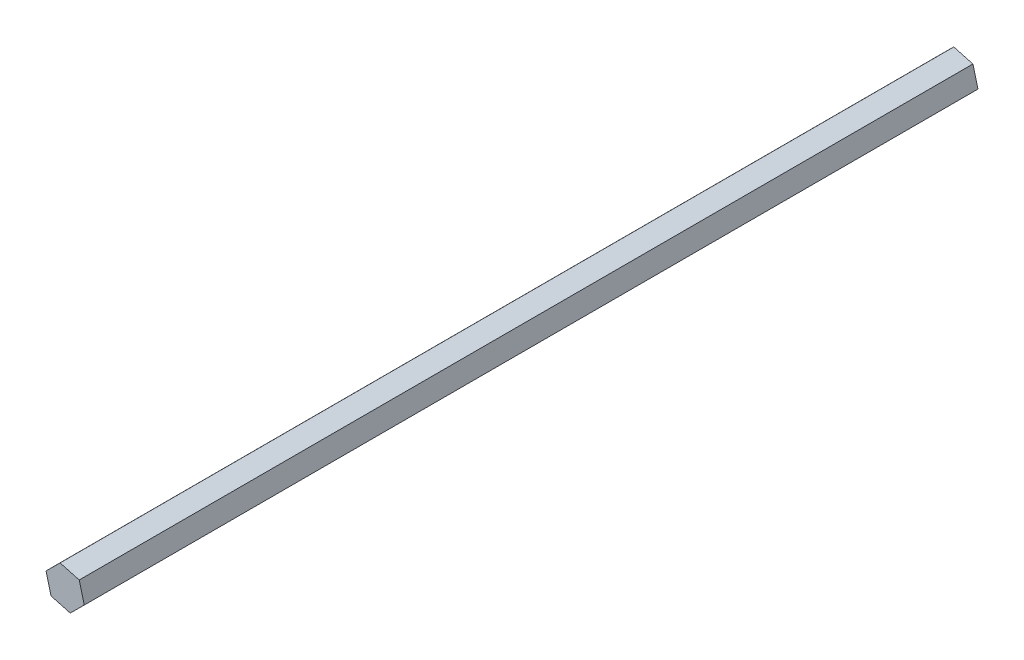
ISO-10303-21;
HEADER;
FILE_DESCRIPTION(('STEP AP214'),'2;1');
FILE_NAME('part.step','',(''),(''),'','','');
FILE_SCHEMA(('AUTOMOTIVE_DESIGN { 1 0 10303 214 1 1 1 1 }'));
ENDSEC;
DATA;
#1=APPLICATION_CONTEXT('core data for automotive mechanical design processes');
#2=APPLICATION_PROTOCOL_DEFINITION('international standard','automotive_design',2000,#1);
#3=PRODUCT_CONTEXT('',#1,'mechanical');
#4=PRODUCT('Part','Part','',(#3));
#5=PRODUCT_RELATED_PRODUCT_CATEGORY('part','',(#4));
#6=PRODUCT_DEFINITION_FORMATION('','',#4);
#7=PRODUCT_DEFINITION_CONTEXT('part definition',#1,'design');
#8=PRODUCT_DEFINITION('design','',#6,#7);
#9=PRODUCT_DEFINITION_SHAPE('','',#8);
#10=(LENGTH_UNIT() NAMED_UNIT(*) SI_UNIT(.MILLI.,.METRE.));
#11=(NAMED_UNIT(*) PLANE_ANGLE_UNIT() SI_UNIT($,.RADIAN.));
#12=(NAMED_UNIT(*) SI_UNIT($,.STERADIAN.) SOLID_ANGLE_UNIT());
#13=UNCERTAINTY_MEASURE_WITH_UNIT(LENGTH_MEASURE(1.E-05),#10,'distance_accuracy_value','');
#14=(GEOMETRIC_REPRESENTATION_CONTEXT(3) GLOBAL_UNCERTAINTY_ASSIGNED_CONTEXT((#13)) GLOBAL_UNIT_ASSIGNED_CONTEXT((#10,
#11,#12)) REPRESENTATION_CONTEXT('',''));
#15=CARTESIAN_POINT('',(0.,0.,0.));
#16=DIRECTION('',(0.,0.,1.));
#17=DIRECTION('',(1.,0.,0.));
#18=AXIS2_PLACEMENT_3D('',#15,#16,#17);
#19=CARTESIAN_POINT('',(-4.30577783898468,-1.01187367327343,330.2));
#20=DIRECTION('',(0.262048083756505,0.965054818028253,0.));
#21=DIRECTION('',(-0.965054818028253,0.262048083756505,0.));
#22=AXIS2_PLACEMENT_3D('',#19,#20,#21);
#23=PLANE('',#22);
#24=DIRECTION('',(0.965054818028253,-0.262048083756505,0.));
#25=VECTOR('',#24,1.);
#26=CARTESIAN_POINT('',(-4.30577783898468,-1.01187367327343,0.));
#27=LINE('',#26,#25);
#28=CARTESIAN_POINT('',(-4.30577783898468,-1.01187367327343,0.));
#29=VERTEX_POINT('',#28);
#30=CARTESIAN_POINT('',(2.77034032995156,-2.93330152583096,0.));
#31=VERTEX_POINT('',#30);
#32=EDGE_CURVE('E128',#29,#31,#27,.T.);
#33=ORIENTED_EDGE('',*,*,#32,.T.);
#34=DIRECTION('',(0.,0.,-1.));
#35=VECTOR('',#34,1.);
#36=CARTESIAN_POINT('',(2.77034032995156,-2.93330152583096,330.2));
#37=LINE('',#36,#35);
#38=CARTESIAN_POINT('',(2.77034032995156,-2.93330152583096,330.2));
#39=VERTEX_POINT('',#38);
#40=EDGE_CURVE('E11',#39,#31,#37,.T.);
#41=ORIENTED_EDGE('',*,*,#40,.F.);
#42=DIRECTION('',(0.965054818028253,-0.262048083756505,0.));
#43=VECTOR('',#42,1.);
#44=CARTESIAN_POINT('',(-4.30577783898468,-1.01187367327343,330.2));
#45=LINE('',#44,#43);
#46=CARTESIAN_POINT('',(-4.30577783898468,-1.01187367327343,330.2));
#47=VERTEX_POINT('',#46);
#48=EDGE_CURVE('E144',#47,#39,#45,.T.);
#49=ORIENTED_EDGE('',*,*,#48,.F.);
#50=DIRECTION('',(0.,0.,-1.));
#51=VECTOR('',#50,1.);
#52=CARTESIAN_POINT('',(-4.30577783898468,-1.01187367327343,330.2));
#53=LINE('',#52,#51);
#54=EDGE_CURVE('E124',#47,#29,#53,.T.);
#55=ORIENTED_EDGE('',*,*,#54,.T.);
#56=EDGE_LOOP('',(#33,#41,#49,#55));
#57=FACE_BOUND('',#56,.T.);
#58=ADVANCED_FACE('F39',(#57),#23,.F.);
#59=CARTESIAN_POINT('',(2.77034032995156,-2.93330152583096,330.2));
#60=DIRECTION('',(-0.704737946578784,0.709467706560291,0.));
#61=DIRECTION('',(-0.709467706560291,-0.704737946578784,0.));
#62=AXIS2_PLACEMENT_3D('',#59,#60,#61);
#63=PLANE('',#62);
#64=DIRECTION('',(0.709467706560291,0.704737946578784,0.));
#65=VECTOR('',#64,1.);
#66=CARTESIAN_POINT('',(2.77034032995156,-2.93330152583096,0.));
#67=LINE('',#66,#65);
#68=CARTESIAN_POINT('',(7.97240474627348,2.23408264236969,0.));
#69=VERTEX_POINT('',#68);
#70=EDGE_CURVE('E132',#31,#69,#67,.T.);
#71=ORIENTED_EDGE('',*,*,#70,.T.);
#72=DIRECTION('',(0.,0.,-1.));
#73=VECTOR('',#72,1.);
#74=CARTESIAN_POINT('',(7.97240474627348,2.23408264236969,330.2));
#75=LINE('',#74,#73);
#76=CARTESIAN_POINT('',(7.97240474627348,2.23408264236969,330.2));
#77=VERTEX_POINT('',#76);
#78=EDGE_CURVE('E48',#77,#69,#75,.T.);
#79=ORIENTED_EDGE('',*,*,#78,.F.);
#80=DIRECTION('',(0.709467706560291,0.704737946578784,0.));
#81=VECTOR('',#80,1.);
#82=CARTESIAN_POINT('',(2.77034032995156,-2.93330152583096,330.2));
#83=LINE('',#82,#81);
#84=EDGE_CURVE('E93',#39,#77,#83,.T.);
#85=ORIENTED_EDGE('',*,*,#84,.F.);
#86=ORIENTED_EDGE('',*,*,#40,.T.);
#87=EDGE_LOOP('',(#71,#79,#85,#86));
#88=FACE_BOUND('',#87,.T.);
#89=ADVANCED_FACE('F172',(#88),#63,.F.);
#90=CARTESIAN_POINT('',(7.97240474627348,2.23408264236969,330.2));
#91=DIRECTION('',(-0.966786030335288,-0.255587111467961,0.));
#92=DIRECTION('',(0.255587111467961,-0.966786030335288,0.));
#93=AXIS2_PLACEMENT_3D('',#90,#91,#92);
#94=PLANE('',#93);
#95=DIRECTION('',(-0.255587111467961,0.966786030335288,0.));
#96=VECTOR('',#95,1.);
#97=CARTESIAN_POINT('',(7.97240474627348,2.23408264236969,0.));
#98=LINE('',#97,#96);
#99=CARTESIAN_POINT('',(6.09835099365917,9.32289466312786,0.));
#100=VERTEX_POINT('',#99);
#101=EDGE_CURVE('E135',#69,#100,#98,.T.);
#102=ORIENTED_EDGE('',*,*,#101,.T.);
#103=DIRECTION('',(0.,0.,-1.));
#104=VECTOR('',#103,1.);
#105=CARTESIAN_POINT('',(6.09835099365917,9.32289466312786,330.2));
#106=LINE('',#105,#104);
#107=CARTESIAN_POINT('',(6.09835099365917,9.32289466312786,330.2));
#108=VERTEX_POINT('',#107);
#109=EDGE_CURVE('E117',#108,#100,#106,.T.);
#110=ORIENTED_EDGE('',*,*,#109,.F.);
#111=DIRECTION('',(-0.255587111467961,0.966786030335288,0.));
#112=VECTOR('',#111,1.);
#113=CARTESIAN_POINT('',(7.97240474627348,2.23408264236969,330.2));
#114=LINE('',#113,#112);
#115=EDGE_CURVE('E106',#77,#108,#114,.T.);
#116=ORIENTED_EDGE('',*,*,#115,.F.);
#117=ORIENTED_EDGE('',*,*,#78,.T.);
#118=EDGE_LOOP('',(#102,#110,#116,#117));
#119=FACE_BOUND('',#118,.T.);
#120=ADVANCED_FACE('F154',(#119),#94,.F.);
#121=CARTESIAN_POINT('',(6.09835099365917,9.32289466312786,330.2));
#122=DIRECTION('',(-0.262048083756504,-0.965054818028253,0.));
#123=DIRECTION('',(0.965054818028253,-0.262048083756504,0.));
#124=AXIS2_PLACEMENT_3D('',#121,#122,#123);
#125=PLANE('',#124);
#126=DIRECTION('',(-0.965054818028253,0.262048083756504,0.));
#127=VECTOR('',#126,1.);
#128=CARTESIAN_POINT('',(6.09835099365917,9.32289466312786,0.));
#129=LINE('',#128,#127);
#130=CARTESIAN_POINT('',(-0.977767175277071,11.2443225156854,0.));
#131=VERTEX_POINT('',#130);
#132=EDGE_CURVE('E115',#100,#131,#129,.T.);
#133=ORIENTED_EDGE('',*,*,#132,.T.);
#134=DIRECTION('',(0.,0.,-1.));
#135=VECTOR('',#134,1.);
#136=CARTESIAN_POINT('',(-0.977767175277071,11.2443225156854,330.2));
#137=LINE('',#136,#135);
#138=CARTESIAN_POINT('',(-0.977767175277071,11.2443225156854,330.2));
#139=VERTEX_POINT('',#138);
#140=EDGE_CURVE('E112',#139,#131,#137,.T.);
#141=ORIENTED_EDGE('',*,*,#140,.F.);
#142=DIRECTION('',(-0.965054818028253,0.262048083756504,0.));
#143=VECTOR('',#142,1.);
#144=CARTESIAN_POINT('',(6.09835099365917,9.32289466312786,330.2));
#145=LINE('',#144,#143);
#146=EDGE_CURVE('E100',#108,#139,#145,.T.);
#147=ORIENTED_EDGE('',*,*,#146,.F.);
#148=ORIENTED_EDGE('',*,*,#109,.T.);
#149=EDGE_LOOP('',(#133,#141,#147,#148));
#150=FACE_BOUND('',#149,.T.);
#151=ADVANCED_FACE('F113',(#150),#125,.F.);
#152=CARTESIAN_POINT('',(-0.977767175277071,11.2443225156854,330.2));
#153=DIRECTION('',(0.704737946578784,-0.709467706560291,0.));
#154=DIRECTION('',(0.709467706560291,0.704737946578784,0.));
#155=AXIS2_PLACEMENT_3D('',#152,#153,#154);
#156=PLANE('',#155);
#157=DIRECTION('',(-0.709467706560291,-0.704737946578784,0.));
#158=VECTOR('',#157,1.);
#159=CARTESIAN_POINT('',(-0.977767175277071,11.2443225156854,0.));
#160=LINE('',#159,#158);
#161=CARTESIAN_POINT('',(-6.17983159159899,6.07693834748475,0.));
#162=VERTEX_POINT('',#161);
#163=EDGE_CURVE('E79',#131,#162,#160,.T.);
#164=ORIENTED_EDGE('',*,*,#163,.T.);
#165=DIRECTION('',(0.,0.,-1.));
#166=VECTOR('',#165,1.);
#167=CARTESIAN_POINT('',(-6.17983159159899,6.07693834748475,330.2));
#168=LINE('',#167,#166);
#169=CARTESIAN_POINT('',(-6.17983159159899,6.07693834748475,330.2));
#170=VERTEX_POINT('',#169);
#171=EDGE_CURVE('E118',#170,#162,#168,.T.);
#172=ORIENTED_EDGE('',*,*,#171,.F.);
#173=DIRECTION('',(-0.709467706560291,-0.704737946578784,0.));
#174=VECTOR('',#173,1.);
#175=CARTESIAN_POINT('',(-0.977767175277071,11.2443225156854,330.2));
#176=LINE('',#175,#174);
#177=EDGE_CURVE('E104',#139,#170,#176,.T.);
#178=ORIENTED_EDGE('',*,*,#177,.F.);
#179=ORIENTED_EDGE('',*,*,#140,.T.);
#180=EDGE_LOOP('',(#164,#172,#178,#179));
#181=FACE_BOUND('',#180,.T.);
#182=ADVANCED_FACE('F120',(#181),#156,.F.);
#183=CARTESIAN_POINT('',(-6.17983159159899,6.07693834748475,330.2));
#184=DIRECTION('',(0.966786030335288,0.255587111467961,0.));
#185=DIRECTION('',(-0.255587111467961,0.966786030335288,0.));
#186=AXIS2_PLACEMENT_3D('',#183,#184,#185);
#187=PLANE('',#186);
#188=DIRECTION('',(0.255587111467961,-0.966786030335288,0.));
#189=VECTOR('',#188,1.);
#190=CARTESIAN_POINT('',(-6.17983159159899,6.07693834748475,0.));
#191=LINE('',#190,#189);
#192=EDGE_CURVE('E85',#162,#29,#191,.T.);
#193=ORIENTED_EDGE('',*,*,#192,.T.);
#194=ORIENTED_EDGE('',*,*,#54,.F.);
#195=DIRECTION('',(0.255587111467961,-0.966786030335288,0.));
#196=VECTOR('',#195,1.);
#197=CARTESIAN_POINT('',(-6.17983159159899,6.07693834748475,330.2));
#198=LINE('',#197,#196);
#199=EDGE_CURVE('E56',#170,#47,#198,.T.);
#200=ORIENTED_EDGE('',*,*,#199,.F.);
#201=ORIENTED_EDGE('',*,*,#171,.T.);
#202=EDGE_LOOP('',(#193,#194,#200,#201));
#203=FACE_BOUND('',#202,.T.);
#204=ADVANCED_FACE('F161',(#203),#187,.F.);
#205=CARTESIAN_POINT('',(0.,0.,330.2));
#206=DIRECTION('',(0.,0.,1.));
#207=DIRECTION('',(1.,0.,0.));
#208=AXIS2_PLACEMENT_3D('',#205,#206,#207);
#209=PLANE('',#208);
#210=ORIENTED_EDGE('',*,*,#48,.T.);
#211=ORIENTED_EDGE('',*,*,#84,.T.);
#212=ORIENTED_EDGE('',*,*,#115,.T.);
#213=ORIENTED_EDGE('',*,*,#146,.T.);
#214=ORIENTED_EDGE('',*,*,#177,.T.);
#215=ORIENTED_EDGE('',*,*,#199,.T.);
#216=EDGE_LOOP('',(#210,#211,#212,#213,#214,#215));
#217=FACE_BOUND('',#216,.T.);
#218=ADVANCED_FACE('F102',(#217),#209,.T.);
#219=CARTESIAN_POINT('',(0.,0.,0.));
#220=DIRECTION('',(0.,0.,1.));
#221=DIRECTION('',(1.,0.,0.));
#222=AXIS2_PLACEMENT_3D('',#219,#220,#221);
#223=PLANE('',#222);
#224=ORIENTED_EDGE('',*,*,#32,.F.);
#225=ORIENTED_EDGE('',*,*,#192,.F.);
#226=ORIENTED_EDGE('',*,*,#163,.F.);
#227=ORIENTED_EDGE('',*,*,#132,.F.);
#228=ORIENTED_EDGE('',*,*,#101,.F.);
#229=ORIENTED_EDGE('',*,*,#70,.F.);
#230=EDGE_LOOP('',(#224,#225,#226,#227,#228,#229));
#231=FACE_BOUND('',#230,.T.);
#232=ADVANCED_FACE('F157',(#231),#223,.F.);
#233=CLOSED_SHELL('',(#58,#89,#120,#151,#182,#204,#218,#232));
#234=MANIFOLD_SOLID_BREP('B2',#233);
#235=ADVANCED_BREP_SHAPE_REPRESENTATION('',(#18,#234),#14);
#236=SHAPE_DEFINITION_REPRESENTATION(#9,#235);
ENDSEC;
END-ISO-10303-21;
